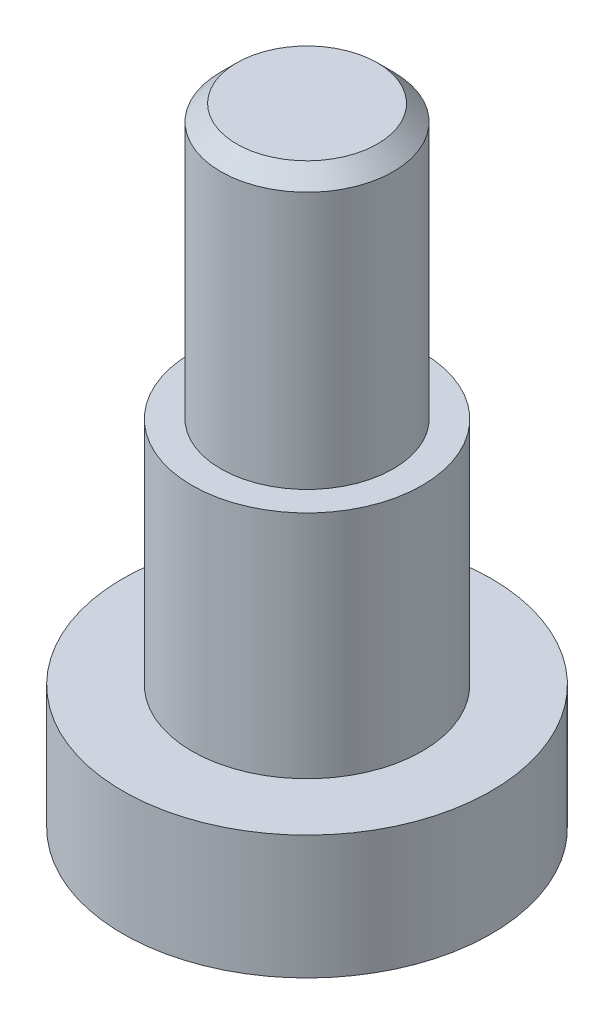
ISO-10303-21;
HEADER;
FILE_DESCRIPTION(('STEP AP214'),'2;1');
FILE_NAME('part.step','',(''),(''),'','','');
FILE_SCHEMA(('AUTOMOTIVE_DESIGN { 1 0 10303 214 1 1 1 1 }'));
ENDSEC;
DATA;
#1=APPLICATION_CONTEXT('core data for automotive mechanical design processes');
#2=APPLICATION_PROTOCOL_DEFINITION('international standard','automotive_design',2000,#1);
#3=PRODUCT_CONTEXT('',#1,'mechanical');
#4=PRODUCT('Part','Part','',(#3));
#5=PRODUCT_RELATED_PRODUCT_CATEGORY('part','',(#4));
#6=PRODUCT_DEFINITION_FORMATION('','',#4);
#7=PRODUCT_DEFINITION_CONTEXT('part definition',#1,'design');
#8=PRODUCT_DEFINITION('design','',#6,#7);
#9=PRODUCT_DEFINITION_SHAPE('','',#8);
#10=(LENGTH_UNIT() NAMED_UNIT(*) SI_UNIT(.MILLI.,.METRE.));
#11=(NAMED_UNIT(*) PLANE_ANGLE_UNIT() SI_UNIT($,.RADIAN.));
#12=(NAMED_UNIT(*) SI_UNIT($,.STERADIAN.) SOLID_ANGLE_UNIT());
#13=UNCERTAINTY_MEASURE_WITH_UNIT(LENGTH_MEASURE(1.E-05),#10,'distance_accuracy_value','');
#14=(GEOMETRIC_REPRESENTATION_CONTEXT(3) GLOBAL_UNCERTAINTY_ASSIGNED_CONTEXT((#13)) GLOBAL_UNIT_ASSIGNED_CONTEXT((#10,
#11,#12)) REPRESENTATION_CONTEXT('',''));
#15=CARTESIAN_POINT('',(0.,0.,0.));
#16=DIRECTION('',(0.,0.,1.));
#17=DIRECTION('',(1.,0.,0.));
#18=AXIS2_PLACEMENT_3D('',#15,#16,#17);
#19=CARTESIAN_POINT('',(0.,4.3,0.));
#20=DIRECTION('',(0.,-1.,0.));
#21=DIRECTION('',(0.,0.,-1.));
#22=AXIS2_PLACEMENT_3D('',#19,#20,#21);
#23=CYLINDRICAL_SURFACE('',#22,6.4);
#24=CARTESIAN_POINT('',(0.,4.3,0.));
#25=DIRECTION('',(0.,1.,0.));
#26=DIRECTION('',(0.,0.,1.));
#27=AXIS2_PLACEMENT_3D('',#24,#25,#26);
#28=CIRCLE('',#27,6.4);
#29=CARTESIAN_POINT('',(0.,4.3,-6.4));
#30=VERTEX_POINT('',#29);
#31=EDGE_CURVE('E163',#30,#30,#28,.T.);
#32=CARTESIAN_POINT('',(0.,0.,0.));
#33=DIRECTION('',(0.,1.,0.));
#34=DIRECTION('',(0.,0.,1.));
#35=AXIS2_PLACEMENT_3D('',#32,#33,#34);
#36=CIRCLE('',#35,6.4);
#37=CARTESIAN_POINT('',(0.,0.,-6.4));
#38=VERTEX_POINT('',#37);
#39=EDGE_CURVE('E48',#38,#38,#36,.T.);
#40=CARTESIAN_POINT('',(0.,4.3,-6.4));
#41=CARTESIAN_POINT('',(0.,4.25520833333333,-6.4));
#42=CARTESIAN_POINT('',(0.,4.21041666666667,-6.4));
#43=CARTESIAN_POINT('',(0.,4.12083333333333,-6.4));
#44=CARTESIAN_POINT('',(0.,4.07604166666667,-6.4));
#45=CARTESIAN_POINT('',(0.,3.98645833333333,-6.4));
#46=CARTESIAN_POINT('',(0.,3.94166666666667,-6.4));
#47=CARTESIAN_POINT('',(0.,3.85208333333333,-6.4));
#48=CARTESIAN_POINT('',(0.,3.80729166666667,-6.4));
#49=CARTESIAN_POINT('',(0.,3.71770833333333,-6.4));
#50=CARTESIAN_POINT('',(0.,3.67291666666667,-6.4));
#51=CARTESIAN_POINT('',(0.,3.58333333333333,-6.4));
#52=CARTESIAN_POINT('',(0.,3.53854166666667,-6.4));
#53=CARTESIAN_POINT('',(0.,3.44895833333333,-6.4));
#54=CARTESIAN_POINT('',(0.,3.40416666666667,-6.4));
#55=CARTESIAN_POINT('',(0.,3.31458333333333,-6.4));
#56=CARTESIAN_POINT('',(0.,3.26979166666667,-6.4));
#57=CARTESIAN_POINT('',(0.,3.18020833333333,-6.4));
#58=CARTESIAN_POINT('',(0.,3.13541666666667,-6.4));
#59=CARTESIAN_POINT('',(0.,3.04583333333333,-6.4));
#60=CARTESIAN_POINT('',(0.,3.00104166666667,-6.4));
#61=CARTESIAN_POINT('',(0.,2.91145833333333,-6.4));
#62=CARTESIAN_POINT('',(0.,2.86666666666667,-6.4));
#63=CARTESIAN_POINT('',(0.,2.77708333333333,-6.4));
#64=CARTESIAN_POINT('',(0.,2.73229166666667,-6.4));
#65=CARTESIAN_POINT('',(0.,2.64270833333333,-6.4));
#66=CARTESIAN_POINT('',(0.,2.59791666666667,-6.4));
#67=CARTESIAN_POINT('',(0.,2.50833333333333,-6.4));
#68=CARTESIAN_POINT('',(0.,2.46354166666667,-6.4));
#69=CARTESIAN_POINT('',(0.,2.37395833333333,-6.4));
#70=CARTESIAN_POINT('',(0.,2.32916666666667,-6.4));
#71=CARTESIAN_POINT('',(0.,2.23958333333333,-6.4));
#72=CARTESIAN_POINT('',(0.,2.19479166666667,-6.4));
#73=CARTESIAN_POINT('',(0.,2.10520833333333,-6.4));
#74=CARTESIAN_POINT('',(0.,2.06041666666667,-6.4));
#75=CARTESIAN_POINT('',(0.,1.97083333333333,-6.4));
#76=CARTESIAN_POINT('',(0.,1.92604166666667,-6.4));
#77=CARTESIAN_POINT('',(0.,1.83645833333333,-6.4));
#78=CARTESIAN_POINT('',(0.,1.79166666666667,-6.4));
#79=CARTESIAN_POINT('',(0.,1.70208333333333,-6.4));
#80=CARTESIAN_POINT('',(0.,1.65729166666667,-6.4));
#81=CARTESIAN_POINT('',(0.,1.56770833333333,-6.4));
#82=CARTESIAN_POINT('',(0.,1.52291666666667,-6.4));
#83=CARTESIAN_POINT('',(0.,1.43333333333333,-6.4));
#84=CARTESIAN_POINT('',(0.,1.38854166666667,-6.4));
#85=CARTESIAN_POINT('',(0.,1.29895833333333,-6.4));
#86=CARTESIAN_POINT('',(0.,1.25416666666667,-6.4));
#87=CARTESIAN_POINT('',(0.,1.16458333333333,-6.4));
#88=CARTESIAN_POINT('',(0.,1.11979166666667,-6.4));
#89=CARTESIAN_POINT('',(0.,1.03020833333333,-6.4));
#90=CARTESIAN_POINT('',(0.,0.985416666666665,-6.4));
#91=CARTESIAN_POINT('',(0.,0.895833333333332,-6.4));
#92=CARTESIAN_POINT('',(0.,0.851041666666665,-6.4));
#93=CARTESIAN_POINT('',(0.,0.761458333333332,-6.4));
#94=CARTESIAN_POINT('',(0.,0.716666666666665,-6.4));
#95=CARTESIAN_POINT('',(0.,0.627083333333332,-6.4));
#96=CARTESIAN_POINT('',(0.,0.582291666666665,-6.4));
#97=CARTESIAN_POINT('',(0.,0.492708333333332,-6.4));
#98=CARTESIAN_POINT('',(0.,0.447916666666665,-6.4));
#99=CARTESIAN_POINT('',(0.,0.358333333333332,-6.4));
#100=CARTESIAN_POINT('',(0.,0.313541666666666,-6.4));
#101=CARTESIAN_POINT('',(0.,0.223958333333332,-6.4));
#102=CARTESIAN_POINT('',(0.,0.179166666666666,-6.4));
#103=CARTESIAN_POINT('',(0.,0.0895833333333324,-6.4));
#104=CARTESIAN_POINT('',(0.,0.0447916666666658,-6.4));
#105=CARTESIAN_POINT('',(0.,0.,-6.4));
#106=B_SPLINE_CURVE_WITH_KNOTS('',3,(#40,#41,#42,#43,#44,#45,#46,#47,#48,#49,#50,#51,#52,#53,
#54,#55,#56,#57,#58,#59,#60,#61,#62,#63,#64,#65,#66,#67,#68,#69,#70,#71,#72,#73,#74,#75,#76,#77,
#78,#79,#80,#81,#82,#83,#84,#85,#86,#87,#88,#89,#90,#91,#92,#93,#94,#95,#96,#97,#98,#99,#100,
#101,#102,#103,#104,#105),.UNSPECIFIED.,.F.,.F.,(4,2,2,2,2,2,2,2,2,2,2,2,2,2,2,2,2,2,2,2,2,2,2,
2,2,2,2,2,2,2,2,2,4),(0.,0.134375000000001,0.268750000000001,0.403125000000001,
0.537500000000001,0.671875000000001,0.806250000000001,0.940625,1.075,1.209375,1.34375,1.478125,
1.6125,1.746875,1.88125,2.015625,2.15,2.284375,2.41875,2.553125,2.6875,2.821875,2.95625,
3.090625,3.225,3.359375,3.49375,3.628125,3.7625,3.896875,4.03125,4.165625,4.3),.UNSPECIFIED.);
#107=EDGE_CURVE('BSEAM45',#30,#38,#106,.T.);
#108=ORIENTED_EDGE('',*,*,#31,.F.);
#109=ORIENTED_EDGE('',*,*,#39,.T.);
#110=ORIENTED_EDGE('',*,*,#107,.T.);
#111=ORIENTED_EDGE('',*,*,#107,.F.);
#112=EDGE_LOOP('',(#108,#110,#109,#111));
#113=FACE_BOUND('',#112,.T.);
#114=ADVANCED_FACE('F45',(#113),#23,.T.);
#115=CARTESIAN_POINT('',(0.,4.3,0.));
#116=DIRECTION('',(0.,1.,0.));
#117=DIRECTION('',(0.,0.,1.));
#118=AXIS2_PLACEMENT_3D('',#115,#116,#117);
#119=PLANE('',#118);
#120=CARTESIAN_POINT('',(0.,4.3,0.));
#121=DIRECTION('',(0.,1.,0.));
#122=DIRECTION('',(0.,0.,1.));
#123=AXIS2_PLACEMENT_3D('',#120,#121,#122);
#124=CIRCLE('',#123,4.);
#125=CARTESIAN_POINT('',(0.,4.3,4.));
#126=VERTEX_POINT('',#125);
#127=EDGE_CURVE('E53',#126,#126,#124,.T.);
#128=ORIENTED_EDGE('',*,*,#127,.F.);
#129=EDGE_LOOP('',(#128));
#130=FACE_BOUND('',#129,.T.);
#131=ORIENTED_EDGE('',*,*,#31,.T.);
#132=EDGE_LOOP('',(#131));
#133=FACE_BOUND('',#132,.T.);
#134=ADVANCED_FACE('F174',(#130,#133),#119,.T.);
#135=CARTESIAN_POINT('',(0.,0.,0.));
#136=DIRECTION('',(0.,1.,0.));
#137=DIRECTION('',(0.,0.,1.));
#138=AXIS2_PLACEMENT_3D('',#135,#136,#137);
#139=PLANE('',#138);
#140=DIRECTION('',(-0.5,0.,0.866025403784439));
#141=VECTOR('',#140,1.);
#142=CARTESIAN_POINT('',(1.8475208614068,0.,0.));
#143=LINE('',#142,#141);
#144=CARTESIAN_POINT('',(1.8475208614068,0.,0.));
#145=VERTEX_POINT('',#144);
#146=CARTESIAN_POINT('',(0.923760430703401,0.,1.6));
#147=VERTEX_POINT('',#146);
#148=EDGE_CURVE('E135',#145,#147,#143,.T.);
#149=ORIENTED_EDGE('',*,*,#148,.F.);
#150=DIRECTION('',(0.5,0.,0.866025403784439));
#151=VECTOR('',#150,1.);
#152=CARTESIAN_POINT('',(0.923760430703401,0.,-1.6));
#153=LINE('',#152,#151);
#154=CARTESIAN_POINT('',(0.923760430703401,0.,-1.6));
#155=VERTEX_POINT('',#154);
#156=EDGE_CURVE('E61',#155,#145,#153,.T.);
#157=ORIENTED_EDGE('',*,*,#156,.F.);
#158=DIRECTION('',(1.,0.,0.));
#159=VECTOR('',#158,1.);
#160=CARTESIAN_POINT('',(-0.923760430703402,0.,-1.6));
#161=LINE('',#160,#159);
#162=CARTESIAN_POINT('',(-0.923760430703402,0.,-1.6));
#163=VERTEX_POINT('',#162);
#164=EDGE_CURVE('E144',#163,#155,#161,.T.);
#165=ORIENTED_EDGE('',*,*,#164,.F.);
#166=DIRECTION('',(0.5,0.,-0.866025403784439));
#167=VECTOR('',#166,1.);
#168=CARTESIAN_POINT('',(-1.8475208614068,0.,0.));
#169=LINE('',#168,#167);
#170=CARTESIAN_POINT('',(-1.8475208614068,0.,0.));
#171=VERTEX_POINT('',#170);
#172=EDGE_CURVE('E142',#171,#163,#169,.T.);
#173=ORIENTED_EDGE('',*,*,#172,.F.);
#174=DIRECTION('',(-0.5,0.,-0.866025403784439));
#175=VECTOR('',#174,1.);
#176=CARTESIAN_POINT('',(-0.923760430703402,0.,1.6));
#177=LINE('',#176,#175);
#178=CARTESIAN_POINT('',(-0.923760430703402,0.,1.6));
#179=VERTEX_POINT('',#178);
#180=EDGE_CURVE('E109',#179,#171,#177,.T.);
#181=ORIENTED_EDGE('',*,*,#180,.F.);
#182=DIRECTION('',(-1.,0.,0.));
#183=VECTOR('',#182,1.);
#184=CARTESIAN_POINT('',(0.923760430703401,0.,1.6));
#185=LINE('',#184,#183);
#186=EDGE_CURVE('E138',#147,#179,#185,.T.);
#187=ORIENTED_EDGE('',*,*,#186,.F.);
#188=EDGE_LOOP('',(#149,#157,#165,#173,#181,#187));
#189=FACE_BOUND('',#188,.T.);
#190=ORIENTED_EDGE('',*,*,#39,.F.);
#191=EDGE_LOOP('',(#190));
#192=FACE_BOUND('',#191,.T.);
#193=ADVANCED_FACE('F171',(#189,#192),#139,.F.);
#194=CARTESIAN_POINT('',(0.,12.3,0.));
#195=DIRECTION('',(0.,-1.,0.));
#196=DIRECTION('',(0.,0.,-1.));
#197=AXIS2_PLACEMENT_3D('',#194,#195,#196);
#198=CYLINDRICAL_SURFACE('',#197,4.);
#199=CARTESIAN_POINT('',(0.,12.3,0.));
#200=DIRECTION('',(0.,1.,0.));
#201=DIRECTION('',(0.,0.,1.));
#202=AXIS2_PLACEMENT_3D('',#199,#200,#201);
#203=CIRCLE('',#202,4.);
#204=CARTESIAN_POINT('',(0.,12.3,4.));
#205=VERTEX_POINT('',#204);
#206=EDGE_CURVE('E158',#205,#205,#203,.T.);
#207=ORIENTED_EDGE('',*,*,#206,.F.);
#208=EDGE_LOOP('',(#207));
#209=FACE_BOUND('',#208,.T.);
#210=ORIENTED_EDGE('',*,*,#127,.T.);
#211=EDGE_LOOP('',(#210));
#212=FACE_BOUND('',#211,.T.);
#213=ADVANCED_FACE('F173',(#209,#212),#198,.T.);
#214=CARTESIAN_POINT('',(0.,12.3,0.));
#215=DIRECTION('',(0.,1.,0.));
#216=DIRECTION('',(0.,0.,1.));
#217=AXIS2_PLACEMENT_3D('',#214,#215,#216);
#218=PLANE('',#217);
#219=CARTESIAN_POINT('',(0.,12.3,0.));
#220=DIRECTION('',(0.,1.,0.));
#221=DIRECTION('',(0.,0.,1.));
#222=AXIS2_PLACEMENT_3D('',#219,#220,#221);
#223=CIRCLE('',#222,3.);
#224=CARTESIAN_POINT('',(0.,12.3,3.));
#225=VERTEX_POINT('',#224);
#226=EDGE_CURVE('E11',#225,#225,#223,.T.);
#227=ORIENTED_EDGE('',*,*,#226,.F.);
#228=EDGE_LOOP('',(#227));
#229=FACE_BOUND('',#228,.T.);
#230=ORIENTED_EDGE('',*,*,#206,.T.);
#231=EDGE_LOOP('',(#230));
#232=FACE_BOUND('',#231,.T.);
#233=ADVANCED_FACE('F181',(#229,#232),#218,.T.);
#234=CARTESIAN_POINT('',(0.,21.8,0.));
#235=DIRECTION('',(0.,-1.,0.));
#236=DIRECTION('',(0.,0.,-1.));
#237=AXIS2_PLACEMENT_3D('',#234,#235,#236);
#238=CYLINDRICAL_SURFACE('',#237,3.);
#239=CARTESIAN_POINT('',(0.,21.2455,0.));
#240=DIRECTION('',(0.,-1.,0.));
#241=DIRECTION('',(0.,0.,-1.));
#242=AXIS2_PLACEMENT_3D('',#239,#240,#241);
#243=CIRCLE('',#242,3.);
#244=CARTESIAN_POINT('',(0.,21.2455,-3.));
#245=VERTEX_POINT('',#244);
#246=EDGE_CURVE('E156',#245,#245,#243,.T.);
#247=ORIENTED_EDGE('',*,*,#246,.T.);
#248=EDGE_LOOP('',(#247));
#249=FACE_BOUND('',#248,.T.);
#250=ORIENTED_EDGE('',*,*,#226,.T.);
#251=EDGE_LOOP('',(#250));
#252=FACE_BOUND('',#251,.T.);
#253=ADVANCED_FACE('F209',(#249,#252),#238,.T.);
#254=CARTESIAN_POINT('',(0.,21.8,0.));
#255=DIRECTION('',(0.,-1.,0.));
#256=DIRECTION('',(0.,0.,-1.));
#257=AXIS2_PLACEMENT_3D('',#254,#255,#256);
#258=CONICAL_SURFACE('',#257,2.4455,0.785398163397464);
#259=ORIENTED_EDGE('',*,*,#246,.F.);
#260=EDGE_LOOP('',(#259));
#261=FACE_BOUND('',#260,.T.);
#262=CARTESIAN_POINT('',(0.,21.8,0.));
#263=DIRECTION('',(0.,-1.,0.));
#264=DIRECTION('',(0.,0.,-1.));
#265=AXIS2_PLACEMENT_3D('',#262,#263,#264);
#266=CIRCLE('',#265,2.4455);
#267=CARTESIAN_POINT('',(0.,21.8,-2.4455));
#268=VERTEX_POINT('',#267);
#269=EDGE_CURVE('E148',#268,#268,#266,.T.);
#270=ORIENTED_EDGE('',*,*,#269,.T.);
#271=EDGE_LOOP('',(#270));
#272=FACE_BOUND('',#271,.T.);
#273=ADVANCED_FACE('F220',(#261,#272),#258,.T.);
#274=CARTESIAN_POINT('',(0.,21.8,0.));
#275=DIRECTION('',(0.,1.,0.));
#276=DIRECTION('',(0.,0.,1.));
#277=AXIS2_PLACEMENT_3D('',#274,#275,#276);
#278=PLANE('',#277);
#279=ORIENTED_EDGE('',*,*,#269,.F.);
#280=EDGE_LOOP('',(#279));
#281=FACE_BOUND('',#280,.T.);
#282=ADVANCED_FACE('F231',(#281),#278,.T.);
#283=CARTESIAN_POINT('',(0.923760430703401,2.,-1.6));
#284=DIRECTION('',(0.866025403784439,0.,-0.5));
#285=DIRECTION('',(-0.5,0.,-0.866025403784439));
#286=AXIS2_PLACEMENT_3D('',#283,#284,#285);
#287=PLANE('',#286);
#288=ORIENTED_EDGE('',*,*,#156,.T.);
#289=DIRECTION('',(0.,-1.,0.));
#290=VECTOR('',#289,1.);
#291=CARTESIAN_POINT('',(1.8475208614068,2.,0.));
#292=LINE('',#291,#290);
#293=CARTESIAN_POINT('',(1.8475208614068,2.,0.));
#294=VERTEX_POINT('',#293);
#295=EDGE_CURVE('E91',#294,#145,#292,.T.);
#296=ORIENTED_EDGE('',*,*,#295,.F.);
#297=DIRECTION('',(0.5,0.,0.866025403784439));
#298=VECTOR('',#297,1.);
#299=CARTESIAN_POINT('',(0.923760430703401,2.,-1.6));
#300=LINE('',#299,#298);
#301=CARTESIAN_POINT('',(0.923760430703401,2.,-1.6));
#302=VERTEX_POINT('',#301);
#303=EDGE_CURVE('E146',#302,#294,#300,.T.);
#304=ORIENTED_EDGE('',*,*,#303,.F.);
#305=DIRECTION('',(0.,-1.,0.));
#306=VECTOR('',#305,1.);
#307=CARTESIAN_POINT('',(0.923760430703401,2.,-1.6));
#308=LINE('',#307,#306);
#309=EDGE_CURVE('E69',#302,#155,#308,.T.);
#310=ORIENTED_EDGE('',*,*,#309,.T.);
#311=EDGE_LOOP('',(#288,#296,#304,#310));
#312=FACE_BOUND('',#311,.T.);
#313=ADVANCED_FACE('F240',(#312),#287,.F.);
#314=CARTESIAN_POINT('',(-0.923760430703402,2.,-1.6));
#315=DIRECTION('',(0.,0.,-1.));
#316=DIRECTION('',(-1.,0.,0.));
#317=AXIS2_PLACEMENT_3D('',#314,#315,#316);
#318=PLANE('',#317);
#319=ORIENTED_EDGE('',*,*,#164,.T.);
#320=ORIENTED_EDGE('',*,*,#309,.F.);
#321=DIRECTION('',(1.,0.,0.));
#322=VECTOR('',#321,1.);
#323=CARTESIAN_POINT('',(-0.923760430703402,2.,-1.6));
#324=LINE('',#323,#322);
#325=CARTESIAN_POINT('',(-0.923760430703402,2.,-1.6));
#326=VERTEX_POINT('',#325);
#327=EDGE_CURVE('E121',#326,#302,#324,.T.);
#328=ORIENTED_EDGE('',*,*,#327,.F.);
#329=DIRECTION('',(0.,-1.,0.));
#330=VECTOR('',#329,1.);
#331=CARTESIAN_POINT('',(-0.923760430703402,2.,-1.6));
#332=LINE('',#331,#330);
#333=EDGE_CURVE('E113',#326,#163,#332,.T.);
#334=ORIENTED_EDGE('',*,*,#333,.T.);
#335=EDGE_LOOP('',(#319,#320,#328,#334));
#336=FACE_BOUND('',#335,.T.);
#337=ADVANCED_FACE('F251',(#336),#318,.F.);
#338=CARTESIAN_POINT('',(-1.8475208614068,2.,0.));
#339=DIRECTION('',(-0.866025403784439,0.,-0.5));
#340=DIRECTION('',(-0.5,0.,0.866025403784439));
#341=AXIS2_PLACEMENT_3D('',#338,#339,#340);
#342=PLANE('',#341);
#343=ORIENTED_EDGE('',*,*,#172,.T.);
#344=ORIENTED_EDGE('',*,*,#333,.F.);
#345=DIRECTION('',(0.5,0.,-0.866025403784439));
#346=VECTOR('',#345,1.);
#347=CARTESIAN_POINT('',(-1.8475208614068,2.,0.));
#348=LINE('',#347,#346);
#349=CARTESIAN_POINT('',(-1.8475208614068,2.,0.));
#350=VERTEX_POINT('',#349);
#351=EDGE_CURVE('E117',#350,#326,#348,.T.);
#352=ORIENTED_EDGE('',*,*,#351,.F.);
#353=DIRECTION('',(0.,-1.,0.));
#354=VECTOR('',#353,1.);
#355=CARTESIAN_POINT('',(-1.8475208614068,2.,0.));
#356=LINE('',#355,#354);
#357=EDGE_CURVE('E102',#350,#171,#356,.T.);
#358=ORIENTED_EDGE('',*,*,#357,.T.);
#359=EDGE_LOOP('',(#343,#344,#352,#358));
#360=FACE_BOUND('',#359,.T.);
#361=ADVANCED_FACE('F118',(#360),#342,.F.);
#362=CARTESIAN_POINT('',(-0.923760430703402,2.,1.6));
#363=DIRECTION('',(-0.866025403784439,0.,0.5));
#364=DIRECTION('',(0.5,0.,0.866025403784439));
#365=AXIS2_PLACEMENT_3D('',#362,#363,#364);
#366=PLANE('',#365);
#367=ORIENTED_EDGE('',*,*,#180,.T.);
#368=ORIENTED_EDGE('',*,*,#357,.F.);
#369=DIRECTION('',(-0.5,0.,-0.866025403784439));
#370=VECTOR('',#369,1.);
#371=CARTESIAN_POINT('',(-0.923760430703402,2.,1.6));
#372=LINE('',#371,#370);
#373=CARTESIAN_POINT('',(-0.923760430703402,2.,1.6));
#374=VERTEX_POINT('',#373);
#375=EDGE_CURVE('E106',#374,#350,#372,.T.);
#376=ORIENTED_EDGE('',*,*,#375,.F.);
#377=DIRECTION('',(0.,-1.,0.));
#378=VECTOR('',#377,1.);
#379=CARTESIAN_POINT('',(-0.923760430703402,2.,1.6));
#380=LINE('',#379,#378);
#381=EDGE_CURVE('E114',#374,#179,#380,.T.);
#382=ORIENTED_EDGE('',*,*,#381,.T.);
#383=EDGE_LOOP('',(#367,#368,#376,#382));
#384=FACE_BOUND('',#383,.T.);
#385=ADVANCED_FACE('F104',(#384),#366,.F.);
#386=CARTESIAN_POINT('',(0.923760430703401,2.,1.6));
#387=DIRECTION('',(0.,0.,1.));
#388=DIRECTION('',(1.,0.,0.));
#389=AXIS2_PLACEMENT_3D('',#386,#387,#388);
#390=PLANE('',#389);
#391=ORIENTED_EDGE('',*,*,#186,.T.);
#392=ORIENTED_EDGE('',*,*,#381,.F.);
#393=DIRECTION('',(-1.,0.,0.));
#394=VECTOR('',#393,1.);
#395=CARTESIAN_POINT('',(0.923760430703401,2.,1.6));
#396=LINE('',#395,#394);
#397=CARTESIAN_POINT('',(0.923760430703401,2.,1.6));
#398=VERTEX_POINT('',#397);
#399=EDGE_CURVE('E127',#398,#374,#396,.T.);
#400=ORIENTED_EDGE('',*,*,#399,.F.);
#401=DIRECTION('',(0.,-1.,0.));
#402=VECTOR('',#401,1.);
#403=CARTESIAN_POINT('',(0.923760430703401,2.,1.6));
#404=LINE('',#403,#402);
#405=EDGE_CURVE('E151',#398,#147,#404,.T.);
#406=ORIENTED_EDGE('',*,*,#405,.T.);
#407=EDGE_LOOP('',(#391,#392,#400,#406));
#408=FACE_BOUND('',#407,.T.);
#409=ADVANCED_FACE('F273',(#408),#390,.F.);
#410=CARTESIAN_POINT('',(1.8475208614068,2.,0.));
#411=DIRECTION('',(0.866025403784439,0.,0.5));
#412=DIRECTION('',(0.5,0.,-0.866025403784439));
#413=AXIS2_PLACEMENT_3D('',#410,#411,#412);
#414=PLANE('',#413);
#415=ORIENTED_EDGE('',*,*,#148,.T.);
#416=ORIENTED_EDGE('',*,*,#405,.F.);
#417=DIRECTION('',(-0.5,0.,0.866025403784439));
#418=VECTOR('',#417,1.);
#419=CARTESIAN_POINT('',(1.8475208614068,2.,0.));
#420=LINE('',#419,#418);
#421=EDGE_CURVE('E129',#294,#398,#420,.T.);
#422=ORIENTED_EDGE('',*,*,#421,.F.);
#423=ORIENTED_EDGE('',*,*,#295,.T.);
#424=EDGE_LOOP('',(#415,#416,#422,#423));
#425=FACE_BOUND('',#424,.T.);
#426=ADVANCED_FACE('F281',(#425),#414,.F.);
#427=CARTESIAN_POINT('',(0.,2.,0.));
#428=DIRECTION('',(0.,-1.,0.));
#429=DIRECTION('',(0.,0.,-1.));
#430=AXIS2_PLACEMENT_3D('',#427,#428,#429);
#431=PLANE('',#430);
#432=ORIENTED_EDGE('',*,*,#303,.T.);
#433=ORIENTED_EDGE('',*,*,#421,.T.);
#434=ORIENTED_EDGE('',*,*,#399,.T.);
#435=ORIENTED_EDGE('',*,*,#375,.T.);
#436=ORIENTED_EDGE('',*,*,#351,.T.);
#437=ORIENTED_EDGE('',*,*,#327,.T.);
#438=EDGE_LOOP('',(#432,#433,#434,#435,#436,#437));
#439=FACE_BOUND('',#438,.T.);
#440=ADVANCED_FACE('F124',(#439),#431,.T.);
#441=CLOSED_SHELL('',(#114,#134,#193,#213,#233,#253,#273,#282,#313,#337,#361,#385,#409,#426,#440));
#442=MANIFOLD_SOLID_BREP('B2',#441);
#443=ADVANCED_BREP_SHAPE_REPRESENTATION('',(#18,#442),#14);
#444=SHAPE_DEFINITION_REPRESENTATION(#9,#443);
ENDSEC;
END-ISO-10303-21;
